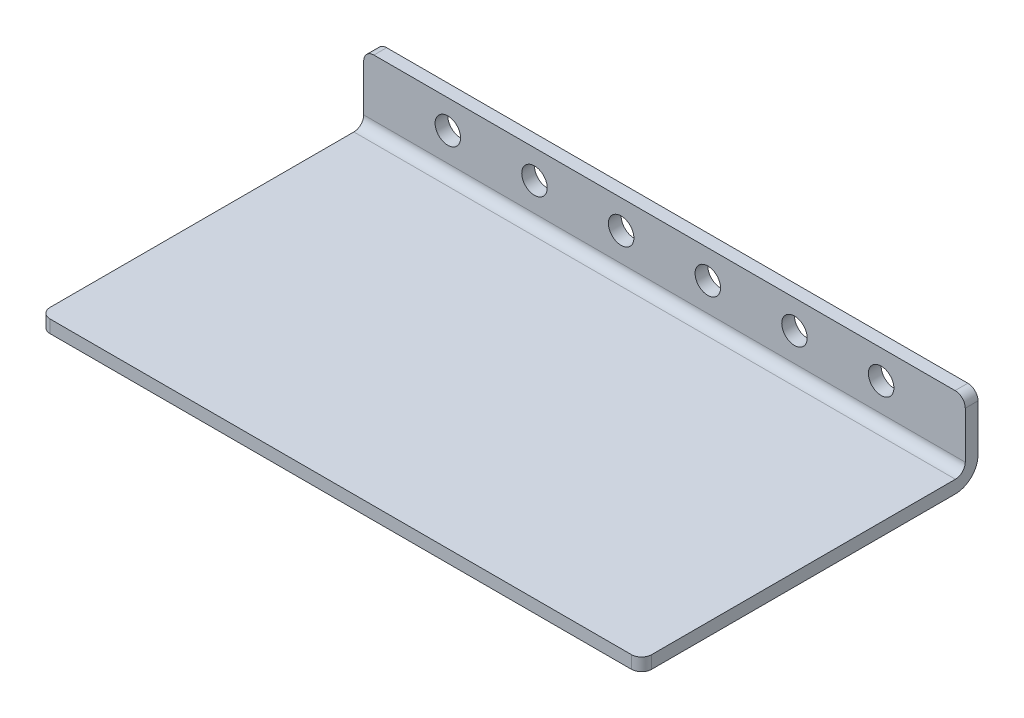
ISO-10303-21;
HEADER;
FILE_DESCRIPTION(('STEP AP214'),'2;1');
FILE_NAME('part.step','',(''),(''),'','','');
FILE_SCHEMA(('AUTOMOTIVE_DESIGN { 1 0 10303 214 1 1 1 1 }'));
ENDSEC;
DATA;
#1=APPLICATION_CONTEXT('core data for automotive mechanical design processes');
#2=APPLICATION_PROTOCOL_DEFINITION('international standard','automotive_design',2000,#1);
#3=PRODUCT_CONTEXT('',#1,'mechanical');
#4=PRODUCT('Part','Part','',(#3));
#5=PRODUCT_RELATED_PRODUCT_CATEGORY('part','',(#4));
#6=PRODUCT_DEFINITION_FORMATION('','',#4);
#7=PRODUCT_DEFINITION_CONTEXT('part definition',#1,'design');
#8=PRODUCT_DEFINITION('design','',#6,#7);
#9=PRODUCT_DEFINITION_SHAPE('','',#8);
#10=(LENGTH_UNIT() NAMED_UNIT(*) SI_UNIT(.MILLI.,.METRE.));
#11=(NAMED_UNIT(*) PLANE_ANGLE_UNIT() SI_UNIT($,.RADIAN.));
#12=(NAMED_UNIT(*) SI_UNIT($,.STERADIAN.) SOLID_ANGLE_UNIT());
#13=UNCERTAINTY_MEASURE_WITH_UNIT(LENGTH_MEASURE(1.E-05),#10,'distance_accuracy_value','');
#14=(GEOMETRIC_REPRESENTATION_CONTEXT(3) GLOBAL_UNCERTAINTY_ASSIGNED_CONTEXT((#13)) GLOBAL_UNIT_ASSIGNED_CONTEXT((#10,
#11,#12)) REPRESENTATION_CONTEXT('',''));
#15=CARTESIAN_POINT('',(0.,0.,0.));
#16=DIRECTION('',(0.,0.,1.));
#17=DIRECTION('',(1.,0.,0.));
#18=AXIS2_PLACEMENT_3D('',#15,#16,#17);
#19=CARTESIAN_POINT('',(-37.465,1.5875,25.1755894893152));
#20=DIRECTION('',(0.,0.,1.));
#21=DIRECTION('',(1.,0.,0.));
#22=AXIS2_PLACEMENT_3D('',#19,#20,#21);
#23=PLANE('',#22);
#24=DIRECTION('',(1.,0.,0.));
#25=VECTOR('',#24,1.);
#26=CARTESIAN_POINT('',(-37.465,1.5875,25.1755894893152));
#27=LINE('',#26,#25);
#28=CARTESIAN_POINT('',(-36.195,1.5875,25.1755894893152));
#29=VERTEX_POINT('',#28);
#30=CARTESIAN_POINT('',(36.195,1.5875,25.1755894893152));
#31=VERTEX_POINT('',#30);
#32=EDGE_CURVE('E193',#29,#31,#27,.T.);
#33=ORIENTED_EDGE('',*,*,#32,.F.);
#34=DIRECTION('',(0.,-1.,0.));
#35=VECTOR('',#34,1.);
#36=CARTESIAN_POINT('',(-36.195,0.,25.1755894893152));
#37=LINE('',#36,#35);
#38=CARTESIAN_POINT('',(-36.195,0.,25.1755894893152));
#39=VERTEX_POINT('',#38);
#40=EDGE_CURVE('E248',#29,#39,#37,.T.);
#41=ORIENTED_EDGE('',*,*,#40,.T.);
#42=DIRECTION('',(1.,0.,0.));
#43=VECTOR('',#42,1.);
#44=CARTESIAN_POINT('',(-37.465,0.,25.1755894893152));
#45=LINE('',#44,#43);
#46=CARTESIAN_POINT('',(36.195,0.,25.1755894893152));
#47=VERTEX_POINT('',#46);
#48=EDGE_CURVE('E154',#39,#47,#45,.T.);
#49=ORIENTED_EDGE('',*,*,#48,.T.);
#50=DIRECTION('',(0.,-1.,0.));
#51=VECTOR('',#50,1.);
#52=CARTESIAN_POINT('',(36.195,1.5875,25.1755894893152));
#53=LINE('',#52,#51);
#54=EDGE_CURVE('E54',#47,#31,#53,.F.);
#55=ORIENTED_EDGE('',*,*,#54,.T.);
#56=EDGE_LOOP('',(#33,#41,#49,#55));
#57=FACE_BOUND('',#56,.T.);
#58=ADVANCED_FACE('F38',(#57),#23,.T.);
#59=CARTESIAN_POINT('',(-37.465,1.5875,25.1755894893152));
#60=DIRECTION('',(0.,1.,0.));
#61=DIRECTION('',(0.,0.,1.));
#62=AXIS2_PLACEMENT_3D('',#59,#60,#61);
#63=PLANE('',#62);
#64=DIRECTION('',(0.,0.,1.));
#65=VECTOR('',#64,1.);
#66=CARTESIAN_POINT('',(-37.465,1.5875,25.1755894893152));
#67=LINE('',#66,#65);
#68=CARTESIAN_POINT('',(-37.465,1.5875,-13.9189746150645));
#69=VERTEX_POINT('',#68);
#70=CARTESIAN_POINT('',(-37.465,1.5875,23.9055894893152));
#71=VERTEX_POINT('',#70);
#72=EDGE_CURVE('E190',#69,#71,#67,.T.);
#73=ORIENTED_EDGE('',*,*,#72,.T.);
#74=CARTESIAN_POINT('',(-36.195,1.5875,23.9055894893152));
#75=DIRECTION('',(0.,1.,0.));
#76=DIRECTION('',(0.,0.,1.));
#77=AXIS2_PLACEMENT_3D('',#74,#75,#76);
#78=CIRCLE('',#77,1.27);
#79=EDGE_CURVE('E11',#71,#29,#78,.T.);
#80=ORIENTED_EDGE('',*,*,#79,.T.);
#81=ORIENTED_EDGE('',*,*,#32,.T.);
#82=CARTESIAN_POINT('',(36.195,1.5875,23.9055894893152));
#83=DIRECTION('',(0.,1.,0.));
#84=DIRECTION('',(0.,0.,1.));
#85=AXIS2_PLACEMENT_3D('',#82,#83,#84);
#86=CIRCLE('',#85,1.27);
#87=CARTESIAN_POINT('',(37.465,1.5875,23.9055894893152));
#88=VERTEX_POINT('',#87);
#89=EDGE_CURVE('E47',#31,#88,#86,.T.);
#90=ORIENTED_EDGE('',*,*,#89,.T.);
#91=DIRECTION('',(0.,0.,1.));
#92=VECTOR('',#91,1.);
#93=CARTESIAN_POINT('',(37.465,1.5875,25.1755894893152));
#94=LINE('',#93,#92);
#95=CARTESIAN_POINT('',(37.465,1.5875,-13.9189746150645));
#96=VERTEX_POINT('',#95);
#97=EDGE_CURVE('E171',#96,#88,#94,.T.);
#98=ORIENTED_EDGE('',*,*,#97,.F.);
#99=DIRECTION('',(1.,0.,0.));
#100=VECTOR('',#99,1.);
#101=CARTESIAN_POINT('',(-37.465,1.5875,-13.9189746150645));
#102=LINE('',#101,#100);
#103=EDGE_CURVE('E196',#69,#96,#102,.T.);
#104=ORIENTED_EDGE('',*,*,#103,.F.);
#105=EDGE_LOOP('',(#73,#80,#81,#90,#98,#104));
#106=FACE_BOUND('',#105,.T.);
#107=ADVANCED_FACE('F260',(#106),#63,.T.);
#108=CARTESIAN_POINT('',(-37.465,2.81543589562034,-13.9189746150645));
#109=DIRECTION('',(1.,0.,0.));
#110=DIRECTION('',(0.,0.,-1.));
#111=AXIS2_PLACEMENT_3D('',#108,#109,#110);
#112=CYLINDRICAL_SURFACE('',#111,1.22793589562034);
#113=ORIENTED_EDGE('',*,*,#103,.T.);
#114=CARTESIAN_POINT('',(37.465,2.81543589562034,-13.9189746150645));
#115=DIRECTION('',(-1.,0.,0.));
#116=DIRECTION('',(0.,0.,-1.));
#117=AXIS2_PLACEMENT_3D('',#114,#115,#116);
#118=CIRCLE('',#117,1.22793589562034);
#119=CARTESIAN_POINT('',(37.465,2.81543589562034,-15.1469105106848));
#120=VERTEX_POINT('',#119);
#121=EDGE_CURVE('E167',#120,#96,#118,.T.);
#122=ORIENTED_EDGE('',*,*,#121,.F.);
#123=DIRECTION('',(1.,0.,0.));
#124=VECTOR('',#123,1.);
#125=CARTESIAN_POINT('',(-37.465,2.81543589562034,-15.1469105106848));
#126=LINE('',#125,#124);
#127=CARTESIAN_POINT('',(-37.465,2.81543589562034,-15.1469105106848));
#128=VERTEX_POINT('',#127);
#129=EDGE_CURVE('E199',#128,#120,#126,.T.);
#130=ORIENTED_EDGE('',*,*,#129,.F.);
#131=CARTESIAN_POINT('',(-37.465,2.81543589562034,-13.9189746150645));
#132=DIRECTION('',(-1.,0.,0.));
#133=DIRECTION('',(0.,0.,-1.));
#134=AXIS2_PLACEMENT_3D('',#131,#132,#133);
#135=CIRCLE('',#134,1.22793589562034);
#136=EDGE_CURVE('E186',#128,#69,#135,.T.);
#137=ORIENTED_EDGE('',*,*,#136,.T.);
#138=EDGE_LOOP('',(#113,#122,#130,#137));
#139=FACE_BOUND('',#138,.T.);
#140=ADVANCED_FACE('F294',(#139),#112,.F.);
#141=CARTESIAN_POINT('',(-37.465,2.81543589562034,-15.1469105106848));
#142=DIRECTION('',(0.,0.,1.));
#143=DIRECTION('',(1.,0.,0.));
#144=AXIS2_PLACEMENT_3D('',#141,#142,#143);
#145=PLANE('',#144);
#146=CARTESIAN_POINT('',(26.9875,6.36071794781018,-15.1469105106848));
#147=DIRECTION('',(0.,0.,1.));
#148=DIRECTION('',(1.,0.,0.));
#149=AXIS2_PLACEMENT_3D('',#146,#147,#148);
#150=CIRCLE('',#149,1.5875);
#151=CARTESIAN_POINT('',(28.575,6.36071794781018,-15.1469105106848));
#152=VERTEX_POINT('',#151);
#153=EDGE_CURVE('E141',#152,#152,#150,.T.);
#154=ORIENTED_EDGE('',*,*,#153,.F.);
#155=EDGE_LOOP('',(#154));
#156=FACE_BOUND('',#155,.T.);
#157=CARTESIAN_POINT('',(16.1925,6.36071794781017,-15.1469105106848));
#158=DIRECTION('',(0.,0.,1.));
#159=DIRECTION('',(1.,0.,0.));
#160=AXIS2_PLACEMENT_3D('',#157,#158,#159);
#161=CIRCLE('',#160,1.5875);
#162=CARTESIAN_POINT('',(17.78,6.36071794781017,-15.1469105106848));
#163=VERTEX_POINT('',#162);
#164=EDGE_CURVE('E460',#163,#163,#161,.T.);
#165=ORIENTED_EDGE('',*,*,#164,.F.);
#166=EDGE_LOOP('',(#165));
#167=FACE_BOUND('',#166,.T.);
#168=CARTESIAN_POINT('',(5.3975,6.36071794781017,-15.1469105106848));
#169=DIRECTION('',(0.,0.,1.));
#170=DIRECTION('',(1.,0.,0.));
#171=AXIS2_PLACEMENT_3D('',#168,#169,#170);
#172=CIRCLE('',#171,1.5875);
#173=CARTESIAN_POINT('',(6.985,6.36071794781017,-15.1469105106848));
#174=VERTEX_POINT('',#173);
#175=EDGE_CURVE('E456',#174,#174,#172,.T.);
#176=ORIENTED_EDGE('',*,*,#175,.F.);
#177=EDGE_LOOP('',(#176));
#178=FACE_BOUND('',#177,.T.);
#179=CARTESIAN_POINT('',(-5.3975,6.36071794781017,-15.1469105106848));
#180=DIRECTION('',(0.,0.,1.));
#181=DIRECTION('',(1.,0.,0.));
#182=AXIS2_PLACEMENT_3D('',#179,#180,#181);
#183=CIRCLE('',#182,1.5875);
#184=CARTESIAN_POINT('',(-3.81,6.36071794781017,-15.1469105106848));
#185=VERTEX_POINT('',#184);
#186=EDGE_CURVE('E452',#185,#185,#183,.T.);
#187=ORIENTED_EDGE('',*,*,#186,.F.);
#188=EDGE_LOOP('',(#187));
#189=FACE_BOUND('',#188,.T.);
#190=CARTESIAN_POINT('',(-16.1925,6.36071794781017,-15.1469105106848));
#191=DIRECTION('',(0.,0.,1.));
#192=DIRECTION('',(1.,0.,0.));
#193=AXIS2_PLACEMENT_3D('',#190,#191,#192);
#194=CIRCLE('',#193,1.5875);
#195=CARTESIAN_POINT('',(-14.605,6.36071794781017,-15.1469105106848));
#196=VERTEX_POINT('',#195);
#197=EDGE_CURVE('E428',#196,#196,#194,.T.);
#198=ORIENTED_EDGE('',*,*,#197,.F.);
#199=EDGE_LOOP('',(#198));
#200=FACE_BOUND('',#199,.T.);
#201=CARTESIAN_POINT('',(-26.9875,6.36071794781017,-15.1469105106848));
#202=DIRECTION('',(0.,0.,1.));
#203=DIRECTION('',(1.,0.,0.));
#204=AXIS2_PLACEMENT_3D('',#201,#202,#203);
#205=CIRCLE('',#204,1.5875);
#206=CARTESIAN_POINT('',(-25.4,6.36071794781017,-15.1469105106848));
#207=VERTEX_POINT('',#206);
#208=EDGE_CURVE('E423',#207,#207,#205,.T.);
#209=ORIENTED_EDGE('',*,*,#208,.F.);
#210=EDGE_LOOP('',(#209));
#211=FACE_BOUND('',#210,.T.);
#212=DIRECTION('',(0.,-1.,0.));
#213=VECTOR('',#212,1.);
#214=CARTESIAN_POINT('',(37.465,2.81543589562034,-15.1469105106848));
#215=LINE('',#214,#213);
#216=CARTESIAN_POINT('',(37.465,8.636,-15.1469105106848));
#217=VERTEX_POINT('',#216);
#218=EDGE_CURVE('E161',#217,#120,#215,.T.);
#219=ORIENTED_EDGE('',*,*,#218,.F.);
#220=CARTESIAN_POINT('',(36.195,8.636,-15.1469105106848));
#221=DIRECTION('',(0.,0.,1.));
#222=DIRECTION('',(1.,0.,0.));
#223=AXIS2_PLACEMENT_3D('',#220,#221,#222);
#224=CIRCLE('',#223,1.27);
#225=CARTESIAN_POINT('',(36.195,9.906,-15.1469105106848));
#226=VERTEX_POINT('',#225);
#227=EDGE_CURVE('E224',#217,#226,#224,.T.);
#228=ORIENTED_EDGE('',*,*,#227,.T.);
#229=DIRECTION('',(1.,0.,0.));
#230=VECTOR('',#229,1.);
#231=CARTESIAN_POINT('',(-37.465,9.906,-15.1469105106848));
#232=LINE('',#231,#230);
#233=CARTESIAN_POINT('',(-36.195,9.906,-15.1469105106848));
#234=VERTEX_POINT('',#233);
#235=EDGE_CURVE('E203',#234,#226,#232,.T.);
#236=ORIENTED_EDGE('',*,*,#235,.F.);
#237=CARTESIAN_POINT('',(-36.195,8.636,-15.1469105106848));
#238=DIRECTION('',(0.,0.,1.));
#239=DIRECTION('',(1.,0.,0.));
#240=AXIS2_PLACEMENT_3D('',#237,#238,#239);
#241=CIRCLE('',#240,1.27);
#242=CARTESIAN_POINT('',(-37.465,8.636,-15.1469105106848));
#243=VERTEX_POINT('',#242);
#244=EDGE_CURVE('E221',#234,#243,#241,.T.);
#245=ORIENTED_EDGE('',*,*,#244,.T.);
#246=DIRECTION('',(0.,-1.,0.));
#247=VECTOR('',#246,1.);
#248=CARTESIAN_POINT('',(-37.465,2.81543589562034,-15.1469105106848));
#249=LINE('',#248,#247);
#250=EDGE_CURVE('E183',#243,#128,#249,.T.);
#251=ORIENTED_EDGE('',*,*,#250,.T.);
#252=ORIENTED_EDGE('',*,*,#129,.T.);
#253=EDGE_LOOP('',(#219,#228,#236,#245,#251,#252));
#254=FACE_BOUND('',#253,.T.);
#255=ADVANCED_FACE('F286',(#156,#167,#178,#189,#200,#211,#254),#145,.T.);
#256=CARTESIAN_POINT('',(-37.465,9.906,-15.1469105106848));
#257=DIRECTION('',(0.,1.,0.));
#258=DIRECTION('',(0.,0.,1.));
#259=AXIS2_PLACEMENT_3D('',#256,#257,#258);
#260=PLANE('',#259);
#261=ORIENTED_EDGE('',*,*,#235,.T.);
#262=DIRECTION('',(0.,0.,1.));
#263=VECTOR('',#262,1.);
#264=CARTESIAN_POINT('',(36.195,9.906,-15.1469105106848));
#265=LINE('',#264,#263);
#266=CARTESIAN_POINT('',(36.195,9.906,-16.7344105106848));
#267=VERTEX_POINT('',#266);
#268=EDGE_CURVE('E231',#226,#267,#265,.F.);
#269=ORIENTED_EDGE('',*,*,#268,.T.);
#270=DIRECTION('',(1.,0.,0.));
#271=VECTOR('',#270,1.);
#272=CARTESIAN_POINT('',(-37.465,9.906,-16.7344105106848));
#273=LINE('',#272,#271);
#274=CARTESIAN_POINT('',(-36.195,9.906,-16.7344105106848));
#275=VERTEX_POINT('',#274);
#276=EDGE_CURVE('E207',#275,#267,#273,.T.);
#277=ORIENTED_EDGE('',*,*,#276,.F.);
#278=DIRECTION('',(0.,0.,1.));
#279=VECTOR('',#278,1.);
#280=CARTESIAN_POINT('',(-36.195,9.906,-15.1469105106848));
#281=LINE('',#280,#279);
#282=EDGE_CURVE('E227',#275,#234,#281,.T.);
#283=ORIENTED_EDGE('',*,*,#282,.T.);
#284=EDGE_LOOP('',(#261,#269,#277,#283));
#285=FACE_BOUND('',#284,.T.);
#286=ADVANCED_FACE('F282',(#285),#260,.T.);
#287=CARTESIAN_POINT('',(-37.465,2.81543589562034,-16.7344105106848));
#288=DIRECTION('',(0.,0.,-1.));
#289=DIRECTION('',(-1.,0.,0.));
#290=AXIS2_PLACEMENT_3D('',#287,#288,#289);
#291=PLANE('',#290);
#292=CARTESIAN_POINT('',(26.9875,6.36071794781018,-16.7344105106848));
#293=DIRECTION('',(0.,0.,-1.));
#294=DIRECTION('',(-1.,0.,0.));
#295=AXIS2_PLACEMENT_3D('',#292,#293,#294);
#296=CIRCLE('',#295,1.5875);
#297=CARTESIAN_POINT('',(25.4,6.36071794781018,-16.7344105106848));
#298=VERTEX_POINT('',#297);
#299=EDGE_CURVE('E421',#298,#298,#296,.T.);
#300=ORIENTED_EDGE('',*,*,#299,.F.);
#301=EDGE_LOOP('',(#300));
#302=FACE_BOUND('',#301,.T.);
#303=CARTESIAN_POINT('',(16.1925,6.36071794781017,-16.7344105106848));
#304=DIRECTION('',(0.,0.,-1.));
#305=DIRECTION('',(-1.,0.,0.));
#306=AXIS2_PLACEMENT_3D('',#303,#304,#305);
#307=CIRCLE('',#306,1.5875);
#308=CARTESIAN_POINT('',(14.605,6.36071794781017,-16.7344105106848));
#309=VERTEX_POINT('',#308);
#310=EDGE_CURVE('E424',#309,#309,#307,.T.);
#311=ORIENTED_EDGE('',*,*,#310,.F.);
#312=EDGE_LOOP('',(#311));
#313=FACE_BOUND('',#312,.T.);
#314=CARTESIAN_POINT('',(5.3975,6.36071794781017,-16.7344105106848));
#315=DIRECTION('',(0.,0.,-1.));
#316=DIRECTION('',(-1.,0.,0.));
#317=AXIS2_PLACEMENT_3D('',#314,#315,#316);
#318=CIRCLE('',#317,1.5875);
#319=CARTESIAN_POINT('',(3.81,6.36071794781017,-16.7344105106848));
#320=VERTEX_POINT('',#319);
#321=EDGE_CURVE('E431',#320,#320,#318,.T.);
#322=ORIENTED_EDGE('',*,*,#321,.F.);
#323=EDGE_LOOP('',(#322));
#324=FACE_BOUND('',#323,.T.);
#325=CARTESIAN_POINT('',(-5.3975,6.36071794781017,-16.7344105106848));
#326=DIRECTION('',(0.,0.,-1.));
#327=DIRECTION('',(-1.,0.,0.));
#328=AXIS2_PLACEMENT_3D('',#325,#326,#327);
#329=CIRCLE('',#328,1.5875);
#330=CARTESIAN_POINT('',(-6.985,6.36071794781017,-16.7344105106848));
#331=VERTEX_POINT('',#330);
#332=EDGE_CURVE('E437',#331,#331,#329,.T.);
#333=ORIENTED_EDGE('',*,*,#332,.F.);
#334=EDGE_LOOP('',(#333));
#335=FACE_BOUND('',#334,.T.);
#336=CARTESIAN_POINT('',(-16.1925,6.36071794781017,-16.7344105106848));
#337=DIRECTION('',(0.,0.,-1.));
#338=DIRECTION('',(-1.,0.,0.));
#339=AXIS2_PLACEMENT_3D('',#336,#337,#338);
#340=CIRCLE('',#339,1.5875);
#341=CARTESIAN_POINT('',(-17.78,6.36071794781017,-16.7344105106848));
#342=VERTEX_POINT('',#341);
#343=EDGE_CURVE('E441',#342,#342,#340,.T.);
#344=ORIENTED_EDGE('',*,*,#343,.F.);
#345=EDGE_LOOP('',(#344));
#346=FACE_BOUND('',#345,.T.);
#347=CARTESIAN_POINT('',(-26.9875,6.36071794781017,-16.7344105106848));
#348=DIRECTION('',(0.,0.,-1.));
#349=DIRECTION('',(-1.,0.,0.));
#350=AXIS2_PLACEMENT_3D('',#347,#348,#349);
#351=CIRCLE('',#350,1.5875);
#352=CARTESIAN_POINT('',(-28.575,6.36071794781017,-16.7344105106848));
#353=VERTEX_POINT('',#352);
#354=EDGE_CURVE('E445',#353,#353,#351,.T.);
#355=ORIENTED_EDGE('',*,*,#354,.F.);
#356=EDGE_LOOP('',(#355));
#357=FACE_BOUND('',#356,.T.);
#358=ORIENTED_EDGE('',*,*,#276,.T.);
#359=CARTESIAN_POINT('',(36.195,8.636,-16.7344105106848));
#360=DIRECTION('',(0.,0.,-1.));
#361=DIRECTION('',(-1.,0.,0.));
#362=AXIS2_PLACEMENT_3D('',#359,#360,#361);
#363=CIRCLE('',#362,1.27);
#364=CARTESIAN_POINT('',(37.465,8.636,-16.7344105106848));
#365=VERTEX_POINT('',#364);
#366=EDGE_CURVE('E237',#267,#365,#363,.T.);
#367=ORIENTED_EDGE('',*,*,#366,.T.);
#368=DIRECTION('',(0.,1.,0.));
#369=VECTOR('',#368,1.);
#370=CARTESIAN_POINT('',(37.465,2.81543589562034,-16.7344105106848));
#371=LINE('',#370,#369);
#372=CARTESIAN_POINT('',(37.465,2.81543589562034,-16.7344105106848));
#373=VERTEX_POINT('',#372);
#374=EDGE_CURVE('E158',#373,#365,#371,.T.);
#375=ORIENTED_EDGE('',*,*,#374,.F.);
#376=DIRECTION('',(1.,0.,0.));
#377=VECTOR('',#376,1.);
#378=CARTESIAN_POINT('',(-37.465,2.81543589562034,-16.7344105106848));
#379=LINE('',#378,#377);
#380=CARTESIAN_POINT('',(-37.465,2.81543589562034,-16.7344105106848));
#381=VERTEX_POINT('',#380);
#382=EDGE_CURVE('E153',#381,#373,#379,.T.);
#383=ORIENTED_EDGE('',*,*,#382,.F.);
#384=DIRECTION('',(0.,1.,0.));
#385=VECTOR('',#384,1.);
#386=CARTESIAN_POINT('',(-37.465,2.81543589562034,-16.7344105106848));
#387=LINE('',#386,#385);
#388=CARTESIAN_POINT('',(-37.465,8.636,-16.7344105106848));
#389=VERTEX_POINT('',#388);
#390=EDGE_CURVE('E179',#381,#389,#387,.T.);
#391=ORIENTED_EDGE('',*,*,#390,.T.);
#392=CARTESIAN_POINT('',(-36.195,8.636,-16.7344105106848));
#393=DIRECTION('',(0.,0.,-1.));
#394=DIRECTION('',(-1.,0.,0.));
#395=AXIS2_PLACEMENT_3D('',#392,#393,#394);
#396=CIRCLE('',#395,1.27);
#397=EDGE_CURVE('E234',#389,#275,#396,.T.);
#398=ORIENTED_EDGE('',*,*,#397,.T.);
#399=EDGE_LOOP('',(#358,#367,#375,#383,#391,#398));
#400=FACE_BOUND('',#399,.T.);
#401=ADVANCED_FACE('F275',(#302,#313,#324,#335,#346,#357,#400),#291,.T.);
#402=CARTESIAN_POINT('',(-37.465,2.81543589562034,-13.9189746150645));
#403=DIRECTION('',(1.,0.,0.));
#404=DIRECTION('',(0.,0.,-1.));
#405=AXIS2_PLACEMENT_3D('',#402,#403,#404);
#406=CYLINDRICAL_SURFACE('',#405,2.81543589562034);
#407=ORIENTED_EDGE('',*,*,#382,.T.);
#408=CARTESIAN_POINT('',(37.465,2.81543589562034,-13.9189746150645));
#409=DIRECTION('',(1.,0.,0.));
#410=DIRECTION('',(0.,0.,-1.));
#411=AXIS2_PLACEMENT_3D('',#408,#409,#410);
#412=CIRCLE('',#411,2.81543589562034);
#413=CARTESIAN_POINT('',(37.465,0.,-13.9189746150645));
#414=VERTEX_POINT('',#413);
#415=EDGE_CURVE('E134',#414,#373,#412,.T.);
#416=ORIENTED_EDGE('',*,*,#415,.F.);
#417=DIRECTION('',(1.,0.,0.));
#418=VECTOR('',#417,1.);
#419=CARTESIAN_POINT('',(-37.465,0.,-13.9189746150645));
#420=LINE('',#419,#418);
#421=CARTESIAN_POINT('',(-37.465,0.,-13.9189746150645));
#422=VERTEX_POINT('',#421);
#423=EDGE_CURVE('E144',#422,#414,#420,.T.);
#424=ORIENTED_EDGE('',*,*,#423,.F.);
#425=CARTESIAN_POINT('',(-37.465,2.81543589562034,-13.9189746150645));
#426=DIRECTION('',(1.,0.,0.));
#427=DIRECTION('',(0.,0.,-1.));
#428=AXIS2_PLACEMENT_3D('',#425,#426,#427);
#429=CIRCLE('',#428,2.81543589562034);
#430=EDGE_CURVE('E176',#422,#381,#429,.T.);
#431=ORIENTED_EDGE('',*,*,#430,.T.);
#432=EDGE_LOOP('',(#407,#416,#424,#431));
#433=FACE_BOUND('',#432,.T.);
#434=ADVANCED_FACE('F156',(#433),#406,.T.);
#435=CARTESIAN_POINT('',(-37.465,0.,25.1755894893152));
#436=DIRECTION('',(0.,-1.,0.));
#437=DIRECTION('',(0.,0.,-1.));
#438=AXIS2_PLACEMENT_3D('',#435,#436,#437);
#439=PLANE('',#438);
#440=ORIENTED_EDGE('',*,*,#48,.F.);
#441=CARTESIAN_POINT('',(-36.195,0.,23.9055894893152));
#442=DIRECTION('',(0.,-1.,0.));
#443=DIRECTION('',(0.,0.,-1.));
#444=AXIS2_PLACEMENT_3D('',#441,#442,#443);
#445=CIRCLE('',#444,1.27);
#446=CARTESIAN_POINT('',(-37.465,0.,23.9055894893152));
#447=VERTEX_POINT('',#446);
#448=EDGE_CURVE('E255',#39,#447,#445,.T.);
#449=ORIENTED_EDGE('',*,*,#448,.T.);
#450=DIRECTION('',(0.,0.,-1.));
#451=VECTOR('',#450,1.);
#452=CARTESIAN_POINT('',(-37.465,0.,25.1755894893152));
#453=LINE('',#452,#451);
#454=EDGE_CURVE('E148',#447,#422,#453,.T.);
#455=ORIENTED_EDGE('',*,*,#454,.T.);
#456=ORIENTED_EDGE('',*,*,#423,.T.);
#457=DIRECTION('',(0.,0.,-1.));
#458=VECTOR('',#457,1.);
#459=CARTESIAN_POINT('',(37.465,0.,25.1755894893152));
#460=LINE('',#459,#458);
#461=CARTESIAN_POINT('',(37.465,0.,23.9055894893152));
#462=VERTEX_POINT('',#461);
#463=EDGE_CURVE('E129',#462,#414,#460,.T.);
#464=ORIENTED_EDGE('',*,*,#463,.F.);
#465=CARTESIAN_POINT('',(36.195,0.,23.9055894893152));
#466=DIRECTION('',(0.,-1.,0.));
#467=DIRECTION('',(0.,0.,-1.));
#468=AXIS2_PLACEMENT_3D('',#465,#466,#467);
#469=CIRCLE('',#468,1.27);
#470=EDGE_CURVE('E252',#462,#47,#469,.T.);
#471=ORIENTED_EDGE('',*,*,#470,.T.);
#472=EDGE_LOOP('',(#440,#449,#455,#456,#464,#471));
#473=FACE_BOUND('',#472,.T.);
#474=ADVANCED_FACE('F146',(#473),#439,.T.);
#475=CARTESIAN_POINT('',(-37.465,2.81543589562034,-13.9189746150645));
#476=DIRECTION('',(1.,0.,0.));
#477=DIRECTION('',(0.,0.,-1.));
#478=AXIS2_PLACEMENT_3D('',#475,#476,#477);
#479=PLANE('',#478);
#480=ORIENTED_EDGE('',*,*,#250,.F.);
#481=DIRECTION('',(0.,0.,1.));
#482=VECTOR('',#481,1.);
#483=CARTESIAN_POINT('',(-37.465,8.636,-16.7344105106848));
#484=LINE('',#483,#482);
#485=EDGE_CURVE('E243',#243,#389,#484,.F.);
#486=ORIENTED_EDGE('',*,*,#485,.T.);
#487=ORIENTED_EDGE('',*,*,#390,.F.);
#488=ORIENTED_EDGE('',*,*,#430,.F.);
#489=ORIENTED_EDGE('',*,*,#454,.F.);
#490=DIRECTION('',(0.,-1.,0.));
#491=VECTOR('',#490,1.);
#492=CARTESIAN_POINT('',(-37.465,1.5875,23.9055894893152));
#493=LINE('',#492,#491);
#494=EDGE_CURVE('E240',#447,#71,#493,.F.);
#495=ORIENTED_EDGE('',*,*,#494,.T.);
#496=ORIENTED_EDGE('',*,*,#72,.F.);
#497=ORIENTED_EDGE('',*,*,#136,.F.);
#498=EDGE_LOOP('',(#480,#486,#487,#488,#489,#495,#496,#497));
#499=FACE_BOUND('',#498,.T.);
#500=ADVANCED_FACE('F269',(#499),#479,.F.);
#501=CARTESIAN_POINT('',(37.465,2.81543589562034,-13.9189746150645));
#502=DIRECTION('',(1.,0.,0.));
#503=DIRECTION('',(0.,0.,-1.));
#504=AXIS2_PLACEMENT_3D('',#501,#502,#503);
#505=PLANE('',#504);
#506=ORIENTED_EDGE('',*,*,#374,.T.);
#507=DIRECTION('',(0.,0.,1.));
#508=VECTOR('',#507,1.);
#509=CARTESIAN_POINT('',(37.465,8.636,-13.9189746150645));
#510=LINE('',#509,#508);
#511=EDGE_CURVE('E217',#365,#217,#510,.T.);
#512=ORIENTED_EDGE('',*,*,#511,.T.);
#513=ORIENTED_EDGE('',*,*,#218,.T.);
#514=ORIENTED_EDGE('',*,*,#121,.T.);
#515=ORIENTED_EDGE('',*,*,#97,.T.);
#516=DIRECTION('',(0.,-1.,0.));
#517=VECTOR('',#516,1.);
#518=CARTESIAN_POINT('',(37.465,2.81543589562034,23.9055894893152));
#519=LINE('',#518,#517);
#520=EDGE_CURVE('E138',#88,#462,#519,.T.);
#521=ORIENTED_EDGE('',*,*,#520,.T.);
#522=ORIENTED_EDGE('',*,*,#463,.T.);
#523=ORIENTED_EDGE('',*,*,#415,.T.);
#524=EDGE_LOOP('',(#506,#512,#513,#514,#515,#521,#522,#523));
#525=FACE_BOUND('',#524,.T.);
#526=ADVANCED_FACE('F132',(#525),#505,.T.);
#527=CARTESIAN_POINT('',(36.195,8.636,-13.9189746150645));
#528=DIRECTION('',(0.,0.,1.));
#529=DIRECTION('',(1.,0.,0.));
#530=AXIS2_PLACEMENT_3D('',#527,#528,#529);
#531=CYLINDRICAL_SURFACE('',#530,1.27);
#532=ORIENTED_EDGE('',*,*,#366,.F.);
#533=ORIENTED_EDGE('',*,*,#268,.F.);
#534=ORIENTED_EDGE('',*,*,#227,.F.);
#535=ORIENTED_EDGE('',*,*,#511,.F.);
#536=EDGE_LOOP('',(#532,#533,#534,#535));
#537=FACE_BOUND('',#536,.T.);
#538=ADVANCED_FACE('F290',(#537),#531,.T.);
#539=CARTESIAN_POINT('',(-36.195,8.636,-15.1469105106848));
#540=DIRECTION('',(0.,0.,-1.));
#541=DIRECTION('',(-1.,0.,0.));
#542=AXIS2_PLACEMENT_3D('',#539,#540,#541);
#543=CYLINDRICAL_SURFACE('',#542,1.27);
#544=ORIENTED_EDGE('',*,*,#397,.F.);
#545=ORIENTED_EDGE('',*,*,#485,.F.);
#546=ORIENTED_EDGE('',*,*,#244,.F.);
#547=ORIENTED_EDGE('',*,*,#282,.F.);
#548=EDGE_LOOP('',(#544,#545,#546,#547));
#549=FACE_BOUND('',#548,.T.);
#550=ADVANCED_FACE('F279',(#549),#543,.T.);
#551=CARTESIAN_POINT('',(-36.195,1.5875,23.9055894893152));
#552=DIRECTION('',(0.,1.,0.));
#553=DIRECTION('',(0.,0.,1.));
#554=AXIS2_PLACEMENT_3D('',#551,#552,#553);
#555=CYLINDRICAL_SURFACE('',#554,1.27);
#556=ORIENTED_EDGE('',*,*,#79,.F.);
#557=ORIENTED_EDGE('',*,*,#494,.F.);
#558=ORIENTED_EDGE('',*,*,#448,.F.);
#559=ORIENTED_EDGE('',*,*,#40,.F.);
#560=EDGE_LOOP('',(#556,#557,#558,#559));
#561=FACE_BOUND('',#560,.T.);
#562=ADVANCED_FACE('F265',(#561),#555,.T.);
#563=CARTESIAN_POINT('',(36.195,2.81543589562034,23.9055894893152));
#564=DIRECTION('',(0.,-1.,0.));
#565=DIRECTION('',(0.,0.,-1.));
#566=AXIS2_PLACEMENT_3D('',#563,#564,#565);
#567=CYLINDRICAL_SURFACE('',#566,1.27);
#568=ORIENTED_EDGE('',*,*,#89,.F.);
#569=ORIENTED_EDGE('',*,*,#54,.F.);
#570=ORIENTED_EDGE('',*,*,#470,.F.);
#571=ORIENTED_EDGE('',*,*,#520,.F.);
#572=EDGE_LOOP('',(#568,#569,#570,#571));
#573=FACE_BOUND('',#572,.T.);
#574=ADVANCED_FACE('F40',(#573),#567,.T.);
#575=CARTESIAN_POINT('',(-26.9875,6.36071794781017,25.1755894893152));
#576=DIRECTION('',(0.,0.,-1.));
#577=DIRECTION('',(-1.,0.,0.));
#578=AXIS2_PLACEMENT_3D('',#575,#576,#577);
#579=CYLINDRICAL_SURFACE('',#578,1.5875);
#580=ORIENTED_EDGE('',*,*,#208,.T.);
#581=EDGE_LOOP('',(#580));
#582=FACE_BOUND('',#581,.T.);
#583=ORIENTED_EDGE('',*,*,#354,.T.);
#584=EDGE_LOOP('',(#583));
#585=FACE_BOUND('',#584,.T.);
#586=ADVANCED_FACE('F318',(#582,#585),#579,.F.);
#587=CARTESIAN_POINT('',(-16.1925,6.36071794781017,25.1755894893152));
#588=DIRECTION('',(0.,0.,-1.));
#589=DIRECTION('',(-1.,0.,0.));
#590=AXIS2_PLACEMENT_3D('',#587,#588,#589);
#591=CYLINDRICAL_SURFACE('',#590,1.5875);
#592=ORIENTED_EDGE('',*,*,#197,.T.);
#593=EDGE_LOOP('',(#592));
#594=FACE_BOUND('',#593,.T.);
#595=ORIENTED_EDGE('',*,*,#343,.T.);
#596=EDGE_LOOP('',(#595));
#597=FACE_BOUND('',#596,.T.);
#598=ADVANCED_FACE('F322',(#594,#597),#591,.F.);
#599=CARTESIAN_POINT('',(-5.3975,6.36071794781017,25.1755894893152));
#600=DIRECTION('',(0.,0.,-1.));
#601=DIRECTION('',(-1.,0.,0.));
#602=AXIS2_PLACEMENT_3D('',#599,#600,#601);
#603=CYLINDRICAL_SURFACE('',#602,1.5875);
#604=ORIENTED_EDGE('',*,*,#186,.T.);
#605=EDGE_LOOP('',(#604));
#606=FACE_BOUND('',#605,.T.);
#607=ORIENTED_EDGE('',*,*,#332,.T.);
#608=EDGE_LOOP('',(#607));
#609=FACE_BOUND('',#608,.T.);
#610=ADVANCED_FACE('F328',(#606,#609),#603,.F.);
#611=CARTESIAN_POINT('',(5.3975,6.36071794781017,25.1755894893152));
#612=DIRECTION('',(0.,0.,-1.));
#613=DIRECTION('',(-1.,0.,0.));
#614=AXIS2_PLACEMENT_3D('',#611,#612,#613);
#615=CYLINDRICAL_SURFACE('',#614,1.5875);
#616=ORIENTED_EDGE('',*,*,#175,.T.);
#617=EDGE_LOOP('',(#616));
#618=FACE_BOUND('',#617,.T.);
#619=ORIENTED_EDGE('',*,*,#321,.T.);
#620=EDGE_LOOP('',(#619));
#621=FACE_BOUND('',#620,.T.);
#622=ADVANCED_FACE('F383',(#618,#621),#615,.F.);
#623=CARTESIAN_POINT('',(16.1925,6.36071794781017,25.1755894893152));
#624=DIRECTION('',(0.,0.,-1.));
#625=DIRECTION('',(-1.,0.,0.));
#626=AXIS2_PLACEMENT_3D('',#623,#624,#625);
#627=CYLINDRICAL_SURFACE('',#626,1.5875);
#628=ORIENTED_EDGE('',*,*,#164,.T.);
#629=EDGE_LOOP('',(#628));
#630=FACE_BOUND('',#629,.T.);
#631=ORIENTED_EDGE('',*,*,#310,.T.);
#632=EDGE_LOOP('',(#631));
#633=FACE_BOUND('',#632,.T.);
#634=ADVANCED_FACE('F392',(#630,#633),#627,.F.);
#635=CARTESIAN_POINT('',(26.9875,6.36071794781018,25.1755894893152));
#636=DIRECTION('',(0.,0.,-1.));
#637=DIRECTION('',(-1.,0.,0.));
#638=AXIS2_PLACEMENT_3D('',#635,#636,#637);
#639=CYLINDRICAL_SURFACE('',#638,1.5875);
#640=ORIENTED_EDGE('',*,*,#153,.T.);
#641=EDGE_LOOP('',(#640));
#642=FACE_BOUND('',#641,.T.);
#643=ORIENTED_EDGE('',*,*,#299,.T.);
#644=EDGE_LOOP('',(#643));
#645=FACE_BOUND('',#644,.T.);
#646=ADVANCED_FACE('F402',(#642,#645),#639,.F.);
#647=CLOSED_SHELL('',(#58,#107,#140,#255,#286,#401,#434,#474,#500,#526,#538,#550,#562,#574,#586,
#598,#610,#622,#634,#646));
#648=MANIFOLD_SOLID_BREP('B2',#647);
#649=ADVANCED_BREP_SHAPE_REPRESENTATION('',(#18,#648),#14);
#650=SHAPE_DEFINITION_REPRESENTATION(#9,#649);
ENDSEC;
END-ISO-10303-21;
